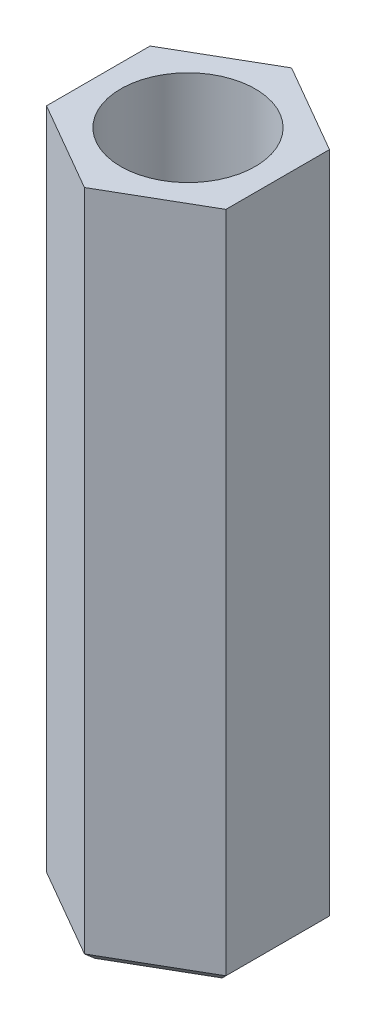
ISO-10303-21;
HEADER;
FILE_DESCRIPTION(('STEP AP214'),'2;1');
FILE_NAME('part.step','',(''),(''),'','','');
FILE_SCHEMA(('AUTOMOTIVE_DESIGN { 1 0 10303 214 1 1 1 1 }'));
ENDSEC;
DATA;
#1=APPLICATION_CONTEXT('core data for automotive mechanical design processes');
#2=APPLICATION_PROTOCOL_DEFINITION('international standard','automotive_design',2000,#1);
#3=PRODUCT_CONTEXT('',#1,'mechanical');
#4=PRODUCT('Part','Part','',(#3));
#5=PRODUCT_RELATED_PRODUCT_CATEGORY('part','',(#4));
#6=PRODUCT_DEFINITION_FORMATION('','',#4);
#7=PRODUCT_DEFINITION_CONTEXT('part definition',#1,'design');
#8=PRODUCT_DEFINITION('design','',#6,#7);
#9=PRODUCT_DEFINITION_SHAPE('','',#8);
#10=(LENGTH_UNIT() NAMED_UNIT(*) SI_UNIT(.MILLI.,.METRE.));
#11=(NAMED_UNIT(*) PLANE_ANGLE_UNIT() SI_UNIT($,.RADIAN.));
#12=(NAMED_UNIT(*) SI_UNIT($,.STERADIAN.) SOLID_ANGLE_UNIT());
#13=UNCERTAINTY_MEASURE_WITH_UNIT(LENGTH_MEASURE(1.E-05),#10,'distance_accuracy_value','');
#14=(GEOMETRIC_REPRESENTATION_CONTEXT(3) GLOBAL_UNCERTAINTY_ASSIGNED_CONTEXT((#13)) GLOBAL_UNIT_ASSIGNED_CONTEXT((#10,
#11,#12)) REPRESENTATION_CONTEXT('',''));
#15=CARTESIAN_POINT('',(0.,0.,0.));
#16=DIRECTION('',(0.,0.,1.));
#17=DIRECTION('',(1.,0.,0.));
#18=AXIS2_PLACEMENT_3D('',#15,#16,#17);
#19=CARTESIAN_POINT('',(0.,15.,0.));
#20=DIRECTION('',(0.,1.,0.));
#21=DIRECTION('',(0.,0.,1.));
#22=AXIS2_PLACEMENT_3D('',#19,#20,#21);
#23=PLANE('',#22);
#24=DIRECTION('',(0.866025403784438,0.,0.5));
#25=VECTOR('',#24,1.);
#26=CARTESIAN_POINT('',(-2.,15.,1.15470053837925));
#27=LINE('',#26,#25);
#28=CARTESIAN_POINT('',(-2.,15.,1.15470053837925));
#29=VERTEX_POINT('',#28);
#30=CARTESIAN_POINT('',(0.,15.,2.3094010767585));
#31=VERTEX_POINT('',#30);
#32=EDGE_CURVE('E126',#29,#31,#27,.T.);
#33=ORIENTED_EDGE('',*,*,#32,.T.);
#34=DIRECTION('',(0.866025403784439,0.,-0.5));
#35=VECTOR('',#34,1.);
#36=CARTESIAN_POINT('',(0.,15.,2.3094010767585));
#37=LINE('',#36,#35);
#38=CARTESIAN_POINT('',(2.,15.,1.15470053837925));
#39=VERTEX_POINT('',#38);
#40=EDGE_CURVE('E114',#31,#39,#37,.T.);
#41=ORIENTED_EDGE('',*,*,#40,.T.);
#42=DIRECTION('',(0.,0.,-1.));
#43=VECTOR('',#42,1.);
#44=CARTESIAN_POINT('',(2.,15.,1.15470053837925));
#45=LINE('',#44,#43);
#46=CARTESIAN_POINT('',(2.,15.,-1.15470053837925));
#47=VERTEX_POINT('',#46);
#48=EDGE_CURVE('E125',#39,#47,#45,.T.);
#49=ORIENTED_EDGE('',*,*,#48,.T.);
#50=DIRECTION('',(-0.866025403784439,0.,-0.5));
#51=VECTOR('',#50,1.);
#52=CARTESIAN_POINT('',(2.,15.,-1.15470053837925));
#53=LINE('',#52,#51);
#54=CARTESIAN_POINT('',(0.,15.,-2.3094010767585));
#55=VERTEX_POINT('',#54);
#56=EDGE_CURVE('E194',#47,#55,#53,.T.);
#57=ORIENTED_EDGE('',*,*,#56,.T.);
#58=DIRECTION('',(-0.866025403784439,0.,0.5));
#59=VECTOR('',#58,1.);
#60=CARTESIAN_POINT('',(0.,15.,-2.3094010767585));
#61=LINE('',#60,#59);
#62=CARTESIAN_POINT('',(-2.,15.,-1.15470053837925));
#63=VERTEX_POINT('',#62);
#64=EDGE_CURVE('E196',#55,#63,#61,.T.);
#65=ORIENTED_EDGE('',*,*,#64,.T.);
#66=DIRECTION('',(0.,0.,1.));
#67=VECTOR('',#66,1.);
#68=CARTESIAN_POINT('',(-2.,15.,-1.15470053837925));
#69=LINE('',#68,#67);
#70=EDGE_CURVE('E131',#63,#29,#69,.T.);
#71=ORIENTED_EDGE('',*,*,#70,.T.);
#72=EDGE_LOOP('',(#33,#41,#49,#57,#65,#71));
#73=FACE_BOUND('',#72,.T.);
#74=CARTESIAN_POINT('',(0.,15.,0.));
#75=DIRECTION('',(0.,1.,0.));
#76=DIRECTION('',(0.,0.,1.));
#77=AXIS2_PLACEMENT_3D('',#74,#75,#76);
#78=CIRCLE('',#77,1.5);
#79=CARTESIAN_POINT('',(0.,15.,1.5));
#80=VERTEX_POINT('',#79);
#81=EDGE_CURVE('E133',#80,#80,#78,.T.);
#82=ORIENTED_EDGE('',*,*,#81,.F.);
#83=EDGE_LOOP('',(#82));
#84=FACE_BOUND('',#83,.T.);
#85=ADVANCED_FACE('F39',(#73,#84),#23,.T.);
#86=CARTESIAN_POINT('',(0.,0.,0.));
#87=DIRECTION('',(0.,1.,0.));
#88=DIRECTION('',(0.,0.,1.));
#89=AXIS2_PLACEMENT_3D('',#86,#87,#88);
#90=PLANE('',#89);
#91=CARTESIAN_POINT('',(0.,0.,0.));
#92=DIRECTION('',(0.,1.,0.));
#93=DIRECTION('',(0.,0.,1.));
#94=AXIS2_PLACEMENT_3D('',#91,#92,#93);
#95=CIRCLE('',#94,1.7);
#96=CARTESIAN_POINT('',(0.,0.,1.7));
#97=VERTEX_POINT('',#96);
#98=EDGE_CURVE('E155',#97,#97,#95,.T.);
#99=ORIENTED_EDGE('',*,*,#98,.T.);
#100=EDGE_LOOP('',(#99));
#101=FACE_BOUND('',#100,.T.);
#102=DIRECTION('',(0.,0.,1.));
#103=VECTOR('',#102,1.);
#104=CARTESIAN_POINT('',(1.8,0.,0.));
#105=LINE('',#104,#103);
#106=CARTESIAN_POINT('',(1.8,0.,-1.03923048454133));
#107=VERTEX_POINT('',#106);
#108=CARTESIAN_POINT('',(1.8,0.,1.03923048454133));
#109=VERTEX_POINT('',#108);
#110=EDGE_CURVE('E150',#107,#109,#105,.T.);
#111=ORIENTED_EDGE('',*,*,#110,.T.);
#112=DIRECTION('',(-0.866025403784439,0.,0.5));
#113=VECTOR('',#112,1.);
#114=CARTESIAN_POINT('',(0.899999999999999,0.,1.55884572681199));
#115=LINE('',#114,#113);
#116=CARTESIAN_POINT('',(0.,0.,2.07846096908265));
#117=VERTEX_POINT('',#116);
#118=EDGE_CURVE('E152',#109,#117,#115,.T.);
#119=ORIENTED_EDGE('',*,*,#118,.T.);
#120=DIRECTION('',(-0.866025403784439,0.,-0.5));
#121=VECTOR('',#120,1.);
#122=CARTESIAN_POINT('',(-0.9,0.,1.55884572681199));
#123=LINE('',#122,#121);
#124=CARTESIAN_POINT('',(-1.8,0.,1.03923048454133));
#125=VERTEX_POINT('',#124);
#126=EDGE_CURVE('E137',#117,#125,#123,.T.);
#127=ORIENTED_EDGE('',*,*,#126,.T.);
#128=DIRECTION('',(0.,0.,-1.));
#129=VECTOR('',#128,1.);
#130=CARTESIAN_POINT('',(-1.8,0.,0.));
#131=LINE('',#130,#129);
#132=CARTESIAN_POINT('',(-1.8,0.,-1.03923048454133));
#133=VERTEX_POINT('',#132);
#134=EDGE_CURVE('E139',#125,#133,#131,.T.);
#135=ORIENTED_EDGE('',*,*,#134,.T.);
#136=DIRECTION('',(0.866025403784439,0.,-0.5));
#137=VECTOR('',#136,1.);
#138=CARTESIAN_POINT('',(-0.899999999999999,0.,-1.55884572681199));
#139=LINE('',#138,#137);
#140=CARTESIAN_POINT('',(0.,0.,-2.07846096908265));
#141=VERTEX_POINT('',#140);
#142=EDGE_CURVE('E146',#133,#141,#139,.T.);
#143=ORIENTED_EDGE('',*,*,#142,.T.);
#144=DIRECTION('',(0.866025403784439,0.,0.5));
#145=VECTOR('',#144,1.);
#146=CARTESIAN_POINT('',(0.9,0.,-1.55884572681199));
#147=LINE('',#146,#145);
#148=EDGE_CURVE('E148',#141,#107,#147,.T.);
#149=ORIENTED_EDGE('',*,*,#148,.T.);
#150=EDGE_LOOP('',(#111,#119,#127,#135,#143,#149));
#151=FACE_BOUND('',#150,.T.);
#152=ADVANCED_FACE('F220',(#101,#151),#90,.F.);
#153=CARTESIAN_POINT('',(-2.,15.,1.15470053837925));
#154=DIRECTION('',(0.5,0.,-0.866025403784438));
#155=DIRECTION('',(-0.866025403784439,0.,-0.5));
#156=AXIS2_PLACEMENT_3D('',#153,#154,#155);
#157=PLANE('',#156);
#158=DIRECTION('',(0.,-1.,0.));
#159=VECTOR('',#158,1.);
#160=CARTESIAN_POINT('',(-2.,15.,1.15470053837925));
#161=LINE('',#160,#159);
#162=CARTESIAN_POINT('',(-2.,0.199999999999999,1.15470053837925));
#163=VERTEX_POINT('',#162);
#164=EDGE_CURVE('E199',#29,#163,#161,.T.);
#165=ORIENTED_EDGE('',*,*,#164,.T.);
#166=DIRECTION('',(0.866025403784439,0.,0.5));
#167=VECTOR('',#166,1.);
#168=CARTESIAN_POINT('',(-2.,0.199999999999999,1.15470053837925));
#169=LINE('',#168,#167);
#170=CARTESIAN_POINT('',(0.,0.199999999999999,2.3094010767585));
#171=VERTEX_POINT('',#170);
#172=EDGE_CURVE('E11',#163,#171,#169,.T.);
#173=ORIENTED_EDGE('',*,*,#172,.T.);
#174=DIRECTION('',(0.,-1.,0.));
#175=VECTOR('',#174,1.);
#176=CARTESIAN_POINT('',(0.,15.,2.3094010767585));
#177=LINE('',#176,#175);
#178=EDGE_CURVE('E119',#31,#171,#177,.T.);
#179=ORIENTED_EDGE('',*,*,#178,.F.);
#180=ORIENTED_EDGE('',*,*,#32,.F.);
#181=EDGE_LOOP('',(#165,#173,#179,#180));
#182=FACE_BOUND('',#181,.T.);
#183=ADVANCED_FACE('F135',(#182),#157,.F.);
#184=CARTESIAN_POINT('',(0.,15.,2.3094010767585));
#185=DIRECTION('',(-0.5,0.,-0.866025403784439));
#186=DIRECTION('',(-0.866025403784439,0.,0.5));
#187=AXIS2_PLACEMENT_3D('',#184,#185,#186);
#188=PLANE('',#187);
#189=ORIENTED_EDGE('',*,*,#178,.T.);
#190=DIRECTION('',(0.866025403784439,0.,-0.5));
#191=VECTOR('',#190,1.);
#192=CARTESIAN_POINT('',(0.,0.199999999999999,2.3094010767585));
#193=LINE('',#192,#191);
#194=CARTESIAN_POINT('',(2.,0.199999999999999,1.15470053837925));
#195=VERTEX_POINT('',#194);
#196=EDGE_CURVE('E161',#171,#195,#193,.T.);
#197=ORIENTED_EDGE('',*,*,#196,.T.);
#198=DIRECTION('',(0.,-1.,0.));
#199=VECTOR('',#198,1.);
#200=CARTESIAN_POINT('',(2.,15.,1.15470053837925));
#201=LINE('',#200,#199);
#202=EDGE_CURVE('E122',#39,#195,#201,.T.);
#203=ORIENTED_EDGE('',*,*,#202,.F.);
#204=ORIENTED_EDGE('',*,*,#40,.F.);
#205=EDGE_LOOP('',(#189,#197,#203,#204));
#206=FACE_BOUND('',#205,.T.);
#207=ADVANCED_FACE('F116',(#206),#188,.F.);
#208=CARTESIAN_POINT('',(2.,15.,1.15470053837925));
#209=DIRECTION('',(-1.,0.,0.));
#210=DIRECTION('',(0.,0.,1.));
#211=AXIS2_PLACEMENT_3D('',#208,#209,#210);
#212=PLANE('',#211);
#213=ORIENTED_EDGE('',*,*,#202,.T.);
#214=DIRECTION('',(0.,0.,-1.));
#215=VECTOR('',#214,1.);
#216=CARTESIAN_POINT('',(2.,0.199999999999999,1.15470053837925));
#217=LINE('',#216,#215);
#218=CARTESIAN_POINT('',(2.,0.199999999999999,-1.15470053837925));
#219=VERTEX_POINT('',#218);
#220=EDGE_CURVE('E163',#195,#219,#217,.T.);
#221=ORIENTED_EDGE('',*,*,#220,.T.);
#222=DIRECTION('',(0.,-1.,0.));
#223=VECTOR('',#222,1.);
#224=CARTESIAN_POINT('',(2.,15.,-1.15470053837925));
#225=LINE('',#224,#223);
#226=EDGE_CURVE('E141',#47,#219,#225,.T.);
#227=ORIENTED_EDGE('',*,*,#226,.F.);
#228=ORIENTED_EDGE('',*,*,#48,.F.);
#229=EDGE_LOOP('',(#213,#221,#227,#228));
#230=FACE_BOUND('',#229,.T.);
#231=ADVANCED_FACE('F257',(#230),#212,.F.);
#232=CARTESIAN_POINT('',(2.,15.,-1.15470053837925));
#233=DIRECTION('',(-0.5,0.,0.866025403784439));
#234=DIRECTION('',(0.866025403784439,0.,0.5));
#235=AXIS2_PLACEMENT_3D('',#232,#233,#234);
#236=PLANE('',#235);
#237=ORIENTED_EDGE('',*,*,#226,.T.);
#238=DIRECTION('',(-0.866025403784439,0.,-0.5));
#239=VECTOR('',#238,1.);
#240=CARTESIAN_POINT('',(2.,0.199999999999999,-1.15470053837925));
#241=LINE('',#240,#239);
#242=CARTESIAN_POINT('',(0.,0.199999999999999,-2.3094010767585));
#243=VERTEX_POINT('',#242);
#244=EDGE_CURVE('E165',#219,#243,#241,.T.);
#245=ORIENTED_EDGE('',*,*,#244,.T.);
#246=DIRECTION('',(0.,-1.,0.));
#247=VECTOR('',#246,1.);
#248=CARTESIAN_POINT('',(0.,15.,-2.3094010767585));
#249=LINE('',#248,#247);
#250=EDGE_CURVE('E203',#55,#243,#249,.T.);
#251=ORIENTED_EDGE('',*,*,#250,.F.);
#252=ORIENTED_EDGE('',*,*,#56,.F.);
#253=EDGE_LOOP('',(#237,#245,#251,#252));
#254=FACE_BOUND('',#253,.T.);
#255=ADVANCED_FACE('F208',(#254),#236,.F.);
#256=CARTESIAN_POINT('',(0.,15.,-2.3094010767585));
#257=DIRECTION('',(0.5,0.,0.866025403784439));
#258=DIRECTION('',(0.866025403784439,0.,-0.5));
#259=AXIS2_PLACEMENT_3D('',#256,#257,#258);
#260=PLANE('',#259);
#261=ORIENTED_EDGE('',*,*,#250,.T.);
#262=DIRECTION('',(-0.866025403784439,0.,0.5));
#263=VECTOR('',#262,1.);
#264=CARTESIAN_POINT('',(0.,0.199999999999999,-2.3094010767585));
#265=LINE('',#264,#263);
#266=CARTESIAN_POINT('',(-2.,0.199999999999999,-1.15470053837925));
#267=VERTEX_POINT('',#266);
#268=EDGE_CURVE('E64',#243,#267,#265,.T.);
#269=ORIENTED_EDGE('',*,*,#268,.T.);
#270=DIRECTION('',(0.,-1.,0.));
#271=VECTOR('',#270,1.);
#272=CARTESIAN_POINT('',(-2.,15.,-1.15470053837925));
#273=LINE('',#272,#271);
#274=EDGE_CURVE('E201',#63,#267,#273,.T.);
#275=ORIENTED_EDGE('',*,*,#274,.F.);
#276=ORIENTED_EDGE('',*,*,#64,.F.);
#277=EDGE_LOOP('',(#261,#269,#275,#276));
#278=FACE_BOUND('',#277,.T.);
#279=ADVANCED_FACE('F252',(#278),#260,.F.);
#280=CARTESIAN_POINT('',(-2.,15.,-1.15470053837925));
#281=DIRECTION('',(1.,0.,0.));
#282=DIRECTION('',(0.,0.,-1.));
#283=AXIS2_PLACEMENT_3D('',#280,#281,#282);
#284=PLANE('',#283);
#285=ORIENTED_EDGE('',*,*,#274,.T.);
#286=DIRECTION('',(0.,0.,1.));
#287=VECTOR('',#286,1.);
#288=CARTESIAN_POINT('',(-2.,0.199999999999999,-1.15470053837925));
#289=LINE('',#288,#287);
#290=EDGE_CURVE('E49',#267,#163,#289,.T.);
#291=ORIENTED_EDGE('',*,*,#290,.T.);
#292=ORIENTED_EDGE('',*,*,#164,.F.);
#293=ORIENTED_EDGE('',*,*,#70,.F.);
#294=EDGE_LOOP('',(#285,#291,#292,#293));
#295=FACE_BOUND('',#294,.T.);
#296=ADVANCED_FACE('F249',(#295),#284,.F.);
#297=CARTESIAN_POINT('',(0.,15.,0.));
#298=DIRECTION('',(0.,-1.,0.));
#299=DIRECTION('',(0.,0.,-1.));
#300=AXIS2_PLACEMENT_3D('',#297,#298,#299);
#301=CYLINDRICAL_SURFACE('',#300,1.5);
#302=CARTESIAN_POINT('',(0.,0.200000000000002,0.));
#303=DIRECTION('',(0.,1.,0.));
#304=DIRECTION('',(0.,0.,1.));
#305=AXIS2_PLACEMENT_3D('',#302,#303,#304);
#306=CIRCLE('',#305,1.5);
#307=CARTESIAN_POINT('',(0.,0.200000000000002,1.5));
#308=VERTEX_POINT('',#307);
#309=EDGE_CURVE('E158',#308,#308,#306,.F.);
#310=ORIENTED_EDGE('',*,*,#309,.T.);
#311=EDGE_LOOP('',(#310));
#312=FACE_BOUND('',#311,.T.);
#313=ORIENTED_EDGE('',*,*,#81,.T.);
#314=EDGE_LOOP('',(#313));
#315=FACE_BOUND('',#314,.T.);
#316=ADVANCED_FACE('F247',(#312,#315),#301,.F.);
#317=CARTESIAN_POINT('',(0.,0.,0.));
#318=DIRECTION('',(0.,-1.,0.));
#319=DIRECTION('',(0.,0.,-1.));
#320=AXIS2_PLACEMENT_3D('',#317,#318,#319);
#321=CONICAL_SURFACE('',#320,1.7,0.785398163397442);
#322=ORIENTED_EDGE('',*,*,#309,.F.);
#323=EDGE_LOOP('',(#322));
#324=FACE_BOUND('',#323,.T.);
#325=ORIENTED_EDGE('',*,*,#98,.F.);
#326=EDGE_LOOP('',(#325));
#327=FACE_BOUND('',#326,.T.);
#328=ADVANCED_FACE('F236',(#324,#327),#321,.F.);
#329=CARTESIAN_POINT('',(0.,0.199999999999999,-2.3094010767585));
#330=DIRECTION('',(0.353553390593272,0.707106781186552,0.612372435695791));
#331=DIRECTION('',(-0.866025403784439,0.,0.5));
#332=AXIS2_PLACEMENT_3D('',#329,#330,#331);
#333=PLANE('',#332);
#334=DIRECTION('',(0.,-0.654653670707973,0.755928946018458));
#335=VECTOR('',#334,1.);
#336=CARTESIAN_POINT('',(0.,0.199999999999999,-2.3094010767585));
#337=LINE('',#336,#335);
#338=EDGE_CURVE('E178',#141,#243,#337,.F.);
#339=ORIENTED_EDGE('',*,*,#338,.F.);
#340=ORIENTED_EDGE('',*,*,#142,.F.);
#341=DIRECTION('',(0.65465367070798,-0.654653670707973,0.37796447300923));
#342=VECTOR('',#341,1.);
#343=CARTESIAN_POINT('',(-2.,0.199999999999999,-1.15470053837925));
#344=LINE('',#343,#342);
#345=EDGE_CURVE('E44',#267,#133,#344,.T.);
#346=ORIENTED_EDGE('',*,*,#345,.F.);
#347=ORIENTED_EDGE('',*,*,#268,.F.);
#348=EDGE_LOOP('',(#339,#340,#346,#347));
#349=FACE_BOUND('',#348,.T.);
#350=ADVANCED_FACE('F42',(#349),#333,.F.);
#351=CARTESIAN_POINT('',(-2.,0.199999999999999,-1.15470053837925));
#352=DIRECTION('',(0.707106781186544,0.707106781186551,0.));
#353=DIRECTION('',(0.,0.,1.));
#354=AXIS2_PLACEMENT_3D('',#351,#352,#353);
#355=PLANE('',#354);
#356=ORIENTED_EDGE('',*,*,#345,.T.);
#357=ORIENTED_EDGE('',*,*,#134,.F.);
#358=DIRECTION('',(0.65465367070798,-0.654653670707974,-0.377964473009229));
#359=VECTOR('',#358,1.);
#360=CARTESIAN_POINT('',(-2.,0.199999999999999,1.15470053837925));
#361=LINE('',#360,#359);
#362=EDGE_CURVE('E176',#163,#125,#361,.T.);
#363=ORIENTED_EDGE('',*,*,#362,.F.);
#364=ORIENTED_EDGE('',*,*,#290,.F.);
#365=EDGE_LOOP('',(#356,#357,#363,#364));
#366=FACE_BOUND('',#365,.T.);
#367=ADVANCED_FACE('F229',(#366),#355,.F.);
#368=CARTESIAN_POINT('',(2.,0.199999999999999,-1.15470053837925));
#369=DIRECTION('',(-0.353553390593272,0.707106781186551,0.612372435695791));
#370=DIRECTION('',(-0.866025403784439,0.,-0.5));
#371=AXIS2_PLACEMENT_3D('',#368,#369,#370);
#372=PLANE('',#371);
#373=ORIENTED_EDGE('',*,*,#338,.T.);
#374=ORIENTED_EDGE('',*,*,#244,.F.);
#375=DIRECTION('',(-0.65465367070798,-0.654653670707973,0.377964473009229));
#376=VECTOR('',#375,1.);
#377=CARTESIAN_POINT('',(2.,0.199999999999999,-1.15470053837925));
#378=LINE('',#377,#376);
#379=EDGE_CURVE('E173',#107,#219,#378,.F.);
#380=ORIENTED_EDGE('',*,*,#379,.F.);
#381=ORIENTED_EDGE('',*,*,#148,.F.);
#382=EDGE_LOOP('',(#373,#374,#380,#381));
#383=FACE_BOUND('',#382,.T.);
#384=ADVANCED_FACE('F212',(#383),#372,.F.);
#385=CARTESIAN_POINT('',(-2.,0.199999999999999,1.15470053837925));
#386=DIRECTION('',(0.353553390593272,0.707106781186551,-0.612372435695792));
#387=DIRECTION('',(0.866025403784439,0.,0.5));
#388=AXIS2_PLACEMENT_3D('',#385,#386,#387);
#389=PLANE('',#388);
#390=ORIENTED_EDGE('',*,*,#362,.T.);
#391=ORIENTED_EDGE('',*,*,#126,.F.);
#392=DIRECTION('',(0.,0.654653670707973,0.755928946018458));
#393=VECTOR('',#392,1.);
#394=CARTESIAN_POINT('',(0.,-0.371428571428573,1.64957219768464));
#395=LINE('',#394,#393);
#396=EDGE_CURVE('E171',#171,#117,#395,.F.);
#397=ORIENTED_EDGE('',*,*,#396,.F.);
#398=ORIENTED_EDGE('',*,*,#172,.F.);
#399=EDGE_LOOP('',(#390,#391,#397,#398));
#400=FACE_BOUND('',#399,.T.);
#401=ADVANCED_FACE('F226',(#400),#389,.F.);
#402=CARTESIAN_POINT('',(2.,0.199999999999999,1.15470053837925));
#403=DIRECTION('',(-0.707106781186544,0.707106781186551,0.));
#404=DIRECTION('',(0.,0.,-1.));
#405=AXIS2_PLACEMENT_3D('',#402,#403,#404);
#406=PLANE('',#405);
#407=ORIENTED_EDGE('',*,*,#379,.T.);
#408=ORIENTED_EDGE('',*,*,#220,.F.);
#409=DIRECTION('',(-0.65465367070798,-0.654653670707973,-0.37796447300923));
#410=VECTOR('',#409,1.);
#411=CARTESIAN_POINT('',(2.,0.199999999999999,1.15470053837925));
#412=LINE('',#411,#410);
#413=EDGE_CURVE('E169',#109,#195,#412,.F.);
#414=ORIENTED_EDGE('',*,*,#413,.F.);
#415=ORIENTED_EDGE('',*,*,#110,.F.);
#416=EDGE_LOOP('',(#407,#408,#414,#415));
#417=FACE_BOUND('',#416,.T.);
#418=ADVANCED_FACE('F216',(#417),#406,.F.);
#419=CARTESIAN_POINT('',(0.,0.199999999999999,2.3094010767585));
#420=DIRECTION('',(-0.353553390593271,0.707106781186552,-0.612372435695791));
#421=DIRECTION('',(0.866025403784439,0.,-0.5));
#422=AXIS2_PLACEMENT_3D('',#419,#420,#421);
#423=PLANE('',#422);
#424=ORIENTED_EDGE('',*,*,#396,.T.);
#425=ORIENTED_EDGE('',*,*,#118,.F.);
#426=ORIENTED_EDGE('',*,*,#413,.T.);
#427=ORIENTED_EDGE('',*,*,#196,.F.);
#428=EDGE_LOOP('',(#424,#425,#426,#427));
#429=FACE_BOUND('',#428,.T.);
#430=ADVANCED_FACE('F222',(#429),#423,.F.);
#431=CLOSED_SHELL('',(#85,#152,#183,#207,#231,#255,#279,#296,#316,#328,#350,#367,#384,#401,#418,#430));
#432=MANIFOLD_SOLID_BREP('B2',#431);
#433=ADVANCED_BREP_SHAPE_REPRESENTATION('',(#18,#432),#14);
#434=SHAPE_DEFINITION_REPRESENTATION(#9,#433);
ENDSEC;
END-ISO-10303-21;
